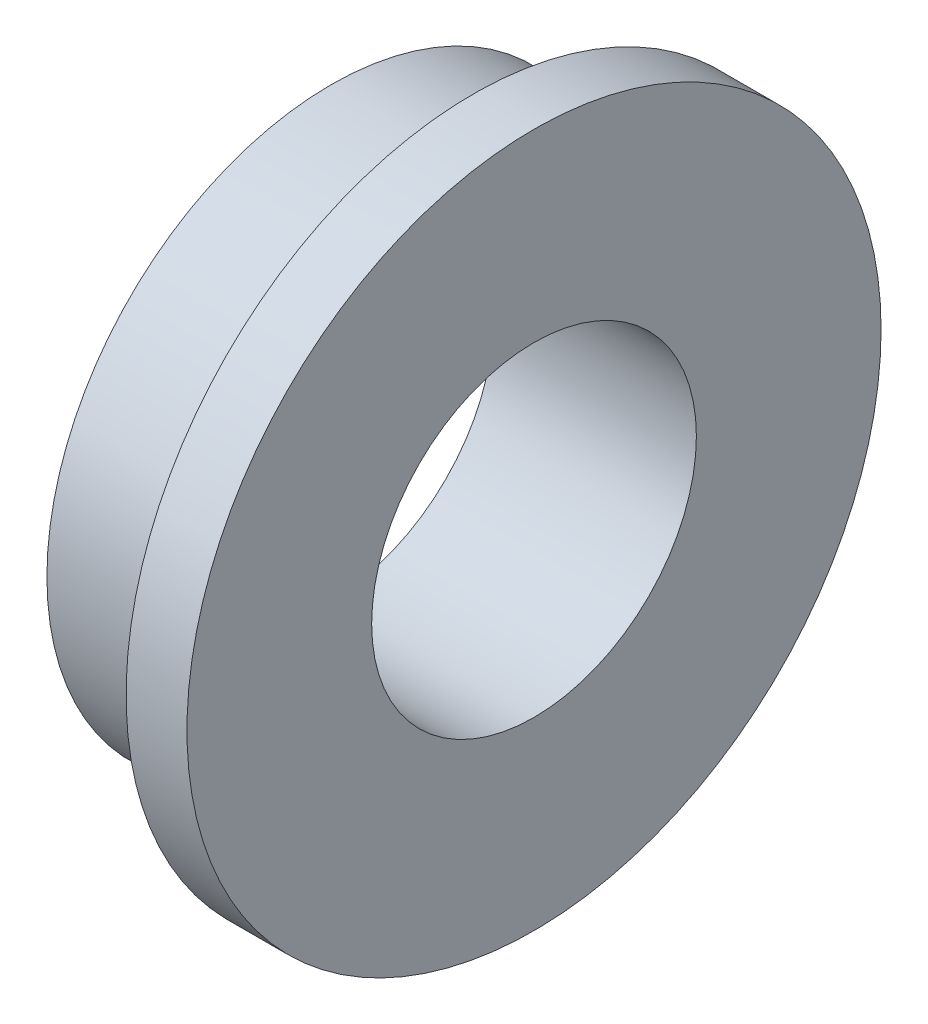
ISO-10303-21;
HEADER;
FILE_DESCRIPTION(('STEP AP214'),'2;1');
FILE_NAME('part.step','',(''),(''),'','','');
FILE_SCHEMA(('AUTOMOTIVE_DESIGN { 1 0 10303 214 1 1 1 1 }'));
ENDSEC;
DATA;
#1=APPLICATION_CONTEXT('core data for automotive mechanical design processes');
#2=APPLICATION_PROTOCOL_DEFINITION('international standard','automotive_design',2000,#1);
#3=PRODUCT_CONTEXT('',#1,'mechanical');
#4=PRODUCT('Part','Part','',(#3));
#5=PRODUCT_RELATED_PRODUCT_CATEGORY('part','',(#4));
#6=PRODUCT_DEFINITION_FORMATION('','',#4);
#7=PRODUCT_DEFINITION_CONTEXT('part definition',#1,'design');
#8=PRODUCT_DEFINITION('design','',#6,#7);
#9=PRODUCT_DEFINITION_SHAPE('','',#8);
#10=(LENGTH_UNIT() NAMED_UNIT(*) SI_UNIT(.MILLI.,.METRE.));
#11=(NAMED_UNIT(*) PLANE_ANGLE_UNIT() SI_UNIT($,.RADIAN.));
#12=(NAMED_UNIT(*) SI_UNIT($,.STERADIAN.) SOLID_ANGLE_UNIT());
#13=UNCERTAINTY_MEASURE_WITH_UNIT(LENGTH_MEASURE(1.E-05),#10,'distance_accuracy_value','');
#14=(GEOMETRIC_REPRESENTATION_CONTEXT(3) GLOBAL_UNCERTAINTY_ASSIGNED_CONTEXT((#13)) GLOBAL_UNIT_ASSIGNED_CONTEXT((#10,
#11,#12)) REPRESENTATION_CONTEXT('',''));
#15=CARTESIAN_POINT('',(0.,0.,0.));
#16=DIRECTION('',(0.,0.,1.));
#17=DIRECTION('',(1.,0.,0.));
#18=AXIS2_PLACEMENT_3D('',#15,#16,#17);
#19=CARTESIAN_POINT('',(0.,8.55,0.));
#20=DIRECTION('',(1.,0.,0.));
#21=DIRECTION('',(0.,0.,-1.));
#22=AXIS2_PLACEMENT_3D('',#19,#20,#21);
#23=PLANE('',#22);
#24=CARTESIAN_POINT('',(0.,0.,0.));
#25=DIRECTION('',(1.,0.,0.));
#26=DIRECTION('',(0.,0.,-1.));
#27=AXIS2_PLACEMENT_3D('',#24,#25,#26);
#28=CIRCLE('',#27,8.55);
#29=CARTESIAN_POINT('',(0.,0.,-8.55));
#30=VERTEX_POINT('',#29);
#31=EDGE_CURVE('E70',#30,#30,#28,.T.);
#32=ORIENTED_EDGE('',*,*,#31,.T.);
#33=EDGE_LOOP('',(#32));
#34=FACE_BOUND('',#33,.T.);
#35=CARTESIAN_POINT('',(0.,0.,0.));
#36=DIRECTION('',(1.,0.,0.));
#37=DIRECTION('',(0.,0.,-1.));
#38=AXIS2_PLACEMENT_3D('',#35,#36,#37);
#39=CIRCLE('',#38,4.);
#40=CARTESIAN_POINT('',(0.,0.,-4.));
#41=VERTEX_POINT('',#40);
#42=EDGE_CURVE('E10',#41,#41,#39,.T.);
#43=ORIENTED_EDGE('',*,*,#42,.F.);
#44=EDGE_LOOP('',(#43));
#45=FACE_BOUND('',#44,.T.);
#46=ADVANCED_FACE('F43',(#34,#45),#23,.T.);
#47=CARTESIAN_POINT('',(0.,0.,0.));
#48=DIRECTION('',(1.,0.,0.));
#49=DIRECTION('',(0.,0.,-1.));
#50=AXIS2_PLACEMENT_3D('',#47,#48,#49);
#51=CYLINDRICAL_SURFACE('',#50,4.);
#52=ORIENTED_EDGE('',*,*,#42,.T.);
#53=EDGE_LOOP('',(#52));
#54=FACE_BOUND('',#53,.T.);
#55=CARTESIAN_POINT('',(-5.,0.,0.));
#56=DIRECTION('',(1.,0.,0.));
#57=DIRECTION('',(0.,0.,-1.));
#58=AXIS2_PLACEMENT_3D('',#55,#56,#57);
#59=CIRCLE('',#58,4.);
#60=CARTESIAN_POINT('',(-5.,0.,-4.));
#61=VERTEX_POINT('',#60);
#62=EDGE_CURVE('E50',#61,#61,#59,.T.);
#63=ORIENTED_EDGE('',*,*,#62,.F.);
#64=EDGE_LOOP('',(#63));
#65=FACE_BOUND('',#64,.T.);
#66=ADVANCED_FACE('F89',(#54,#65),#51,.F.);
#67=CARTESIAN_POINT('',(-5.,4.,0.));
#68=DIRECTION('',(-1.,0.,0.));
#69=DIRECTION('',(0.,0.,1.));
#70=AXIS2_PLACEMENT_3D('',#67,#68,#69);
#71=PLANE('',#70);
#72=ORIENTED_EDGE('',*,*,#62,.T.);
#73=EDGE_LOOP('',(#72));
#74=FACE_BOUND('',#73,.T.);
#75=CARTESIAN_POINT('',(-5.,0.,0.));
#76=DIRECTION('',(1.,0.,0.));
#77=DIRECTION('',(0.,0.,-1.));
#78=AXIS2_PLACEMENT_3D('',#75,#76,#77);
#79=CIRCLE('',#78,7.);
#80=CARTESIAN_POINT('',(-5.,0.,-7.));
#81=VERTEX_POINT('',#80);
#82=EDGE_CURVE('E55',#81,#81,#79,.T.);
#83=ORIENTED_EDGE('',*,*,#82,.F.);
#84=EDGE_LOOP('',(#83));
#85=FACE_BOUND('',#84,.T.);
#86=ADVANCED_FACE('F93',(#74,#85),#71,.T.);
#87=CARTESIAN_POINT('',(0.,0.,0.));
#88=DIRECTION('',(1.,0.,0.));
#89=DIRECTION('',(0.,0.,-1.));
#90=AXIS2_PLACEMENT_3D('',#87,#88,#89);
#91=CYLINDRICAL_SURFACE('',#90,7.);
#92=ORIENTED_EDGE('',*,*,#82,.T.);
#93=EDGE_LOOP('',(#92));
#94=FACE_BOUND('',#93,.T.);
#95=CARTESIAN_POINT('',(-1.5,0.,0.));
#96=DIRECTION('',(1.,0.,0.));
#97=DIRECTION('',(0.,0.,-1.));
#98=AXIS2_PLACEMENT_3D('',#95,#96,#97);
#99=CIRCLE('',#98,7.);
#100=CARTESIAN_POINT('',(-1.5,0.,-7.));
#101=VERTEX_POINT('',#100);
#102=EDGE_CURVE('E60',#101,#101,#99,.T.);
#103=ORIENTED_EDGE('',*,*,#102,.F.);
#104=EDGE_LOOP('',(#103));
#105=FACE_BOUND('',#104,.T.);
#106=ADVANCED_FACE('F85',(#94,#105),#91,.T.);
#107=CARTESIAN_POINT('',(-1.5,7.,0.));
#108=DIRECTION('',(-1.,0.,0.));
#109=DIRECTION('',(0.,0.,1.));
#110=AXIS2_PLACEMENT_3D('',#107,#108,#109);
#111=PLANE('',#110);
#112=ORIENTED_EDGE('',*,*,#102,.T.);
#113=EDGE_LOOP('',(#112));
#114=FACE_BOUND('',#113,.T.);
#115=CARTESIAN_POINT('',(-1.5,0.,0.));
#116=DIRECTION('',(1.,0.,0.));
#117=DIRECTION('',(0.,0.,-1.));
#118=AXIS2_PLACEMENT_3D('',#115,#116,#117);
#119=CIRCLE('',#118,8.55);
#120=CARTESIAN_POINT('',(-1.5,0.,-8.55));
#121=VERTEX_POINT('',#120);
#122=EDGE_CURVE('E66',#121,#121,#119,.T.);
#123=ORIENTED_EDGE('',*,*,#122,.F.);
#124=EDGE_LOOP('',(#123));
#125=FACE_BOUND('',#124,.T.);
#126=ADVANCED_FACE('F79',(#114,#125),#111,.T.);
#127=CARTESIAN_POINT('',(0.,0.,0.));
#128=DIRECTION('',(1.,0.,0.));
#129=DIRECTION('',(0.,0.,-1.));
#130=AXIS2_PLACEMENT_3D('',#127,#128,#129);
#131=CYLINDRICAL_SURFACE('',#130,8.55);
#132=ORIENTED_EDGE('',*,*,#122,.T.);
#133=EDGE_LOOP('',(#132));
#134=FACE_BOUND('',#133,.T.);
#135=ORIENTED_EDGE('',*,*,#31,.F.);
#136=EDGE_LOOP('',(#135));
#137=FACE_BOUND('',#136,.T.);
#138=ADVANCED_FACE('F77',(#134,#137),#131,.T.);
#139=CLOSED_SHELL('',(#46,#66,#86,#106,#126,#138));
#140=MANIFOLD_SOLID_BREP('B2',#139);
#141=ADVANCED_BREP_SHAPE_REPRESENTATION('',(#18,#140),#14);
#142=SHAPE_DEFINITION_REPRESENTATION(#9,#141);
ENDSEC;
END-ISO-10303-21;
